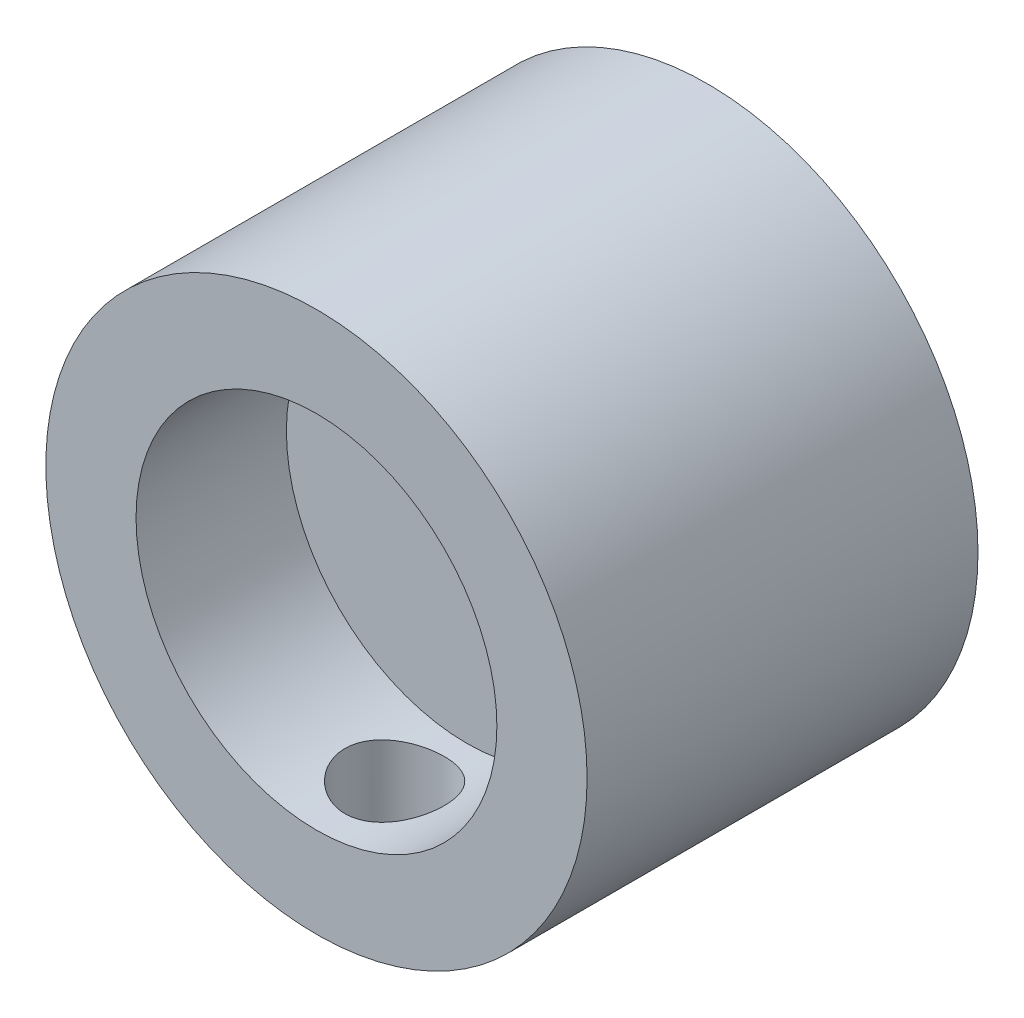
ISO-10303-21;
HEADER;
FILE_DESCRIPTION(('STEP AP214'),'2;1');
FILE_NAME('part.step','',(''),(''),'','','');
FILE_SCHEMA(('AUTOMOTIVE_DESIGN { 1 0 10303 214 1 1 1 1 }'));
ENDSEC;
DATA;
#1=APPLICATION_CONTEXT('core data for automotive mechanical design processes');
#2=APPLICATION_PROTOCOL_DEFINITION('international standard','automotive_design',2000,#1);
#3=PRODUCT_CONTEXT('',#1,'mechanical');
#4=PRODUCT('Part','Part','',(#3));
#5=PRODUCT_RELATED_PRODUCT_CATEGORY('part','',(#4));
#6=PRODUCT_DEFINITION_FORMATION('','',#4);
#7=PRODUCT_DEFINITION_CONTEXT('part definition',#1,'design');
#8=PRODUCT_DEFINITION('design','',#6,#7);
#9=PRODUCT_DEFINITION_SHAPE('','',#8);
#10=(LENGTH_UNIT() NAMED_UNIT(*) SI_UNIT(.MILLI.,.METRE.));
#11=(NAMED_UNIT(*) PLANE_ANGLE_UNIT() SI_UNIT($,.RADIAN.));
#12=(NAMED_UNIT(*) SI_UNIT($,.STERADIAN.) SOLID_ANGLE_UNIT());
#13=UNCERTAINTY_MEASURE_WITH_UNIT(LENGTH_MEASURE(1.E-05),#10,'distance_accuracy_value','');
#14=(GEOMETRIC_REPRESENTATION_CONTEXT(3) GLOBAL_UNCERTAINTY_ASSIGNED_CONTEXT((#13)) GLOBAL_UNIT_ASSIGNED_CONTEXT((#10,
#11,#12)) REPRESENTATION_CONTEXT('',''));
#15=CARTESIAN_POINT('',(0.,0.,0.));
#16=DIRECTION('',(0.,0.,1.));
#17=DIRECTION('',(1.,0.,0.));
#18=AXIS2_PLACEMENT_3D('',#15,#16,#17);
#19=CARTESIAN_POINT('',(0.,0.,6.5));
#20=DIRECTION('',(0.,0.,-1.));
#21=DIRECTION('',(-1.,0.,0.));
#22=AXIS2_PLACEMENT_3D('',#19,#20,#21);
#23=CYLINDRICAL_SURFACE('',#22,4.5);
#24=CARTESIAN_POINT('',(0.,-4.5,6.025));
#25=CARTESIAN_POINT('',(-0.0459281700928139,-4.49999917530483,6.02499822559568));
#26=CARTESIAN_POINT('',(-0.0918796431094405,-4.49928959442492,6.02115177345704));
#27=CARTESIAN_POINT('',(-0.182488974482907,-4.49652731514372,6.00587676549296));
#28=CARTESIAN_POINT('',(-0.227145686129448,-4.49447346197503,5.99444169071123));
#29=CARTESIAN_POINT('',(-0.313841871802195,-4.48925251684029,5.96435029818314));
#30=CARTESIAN_POINT('',(-0.355883625116798,-4.48608641082328,5.94570037451382));
#31=CARTESIAN_POINT('',(-0.436237131717848,-4.47898719212324,5.90172655162366));
#32=CARTESIAN_POINT('',(-0.474549212335565,-4.47505414684107,5.87640323881108));
#33=CARTESIAN_POINT('',(-0.54679955178278,-4.46680510507215,5.81949294539273));
#34=CARTESIAN_POINT('',(-0.580688828252395,-4.46248558919924,5.78784428299845));
#35=CARTESIAN_POINT('',(-0.642707950767929,-4.45397673185431,5.71931438725124));
#36=CARTESIAN_POINT('',(-0.670837394039364,-4.44978739950315,5.68243278827382));
#37=CARTESIAN_POINT('',(-0.720740551756165,-4.44197906683741,5.60413979045922));
#38=CARTESIAN_POINT('',(-0.742464727157539,-4.43836460664535,5.562696323368));
#39=CARTESIAN_POINT('',(-0.778623622334913,-4.43216470314533,5.4766707332707));
#40=CARTESIAN_POINT('',(-0.793058941899276,-4.42957917517188,5.43208886886246));
#41=CARTESIAN_POINT('',(-0.814073749187005,-4.42576522816216,5.34157512682287));
#42=CARTESIAN_POINT('',(-0.820738486828356,-4.42452209331529,5.29566367412523));
#43=CARTESIAN_POINT('',(-0.826287493464283,-4.42348928929569,5.20335864811991));
#44=CARTESIAN_POINT('',(-0.825172429190118,-4.42369949557121,5.15696511646678));
#45=CARTESIAN_POINT('',(-0.815262676170229,-4.42553621693648,5.06562858931755));
#46=CARTESIAN_POINT('',(-0.806564679150546,-4.42714489900884,5.02067469162685));
#47=CARTESIAN_POINT('',(-0.781888128439733,-4.43156932381324,4.93287522372715));
#48=CARTESIAN_POINT('',(-0.76590927773408,-4.43438511578774,4.89002973960759));
#49=CARTESIAN_POINT('',(-0.727029318734104,-4.44092526396813,4.80737904374082));
#50=CARTESIAN_POINT('',(-0.704088936831296,-4.44465475118186,4.76759272957657));
#51=CARTESIAN_POINT('',(-0.651964906185915,-4.45259864386441,4.69239770934376));
#52=CARTESIAN_POINT('',(-0.622780650798149,-4.45681309643332,4.65698942916612));
#53=CARTESIAN_POINT('',(-0.558474835646661,-4.46532989936113,4.59099670711122));
#54=CARTESIAN_POINT('',(-0.523270517507556,-4.46963261790336,4.560492898328));
#55=CARTESIAN_POINT('',(-0.44820144062049,-4.47778277623231,4.50581214608005));
#56=CARTESIAN_POINT('',(-0.408336638963445,-4.48163021182659,4.48163526087394));
#57=CARTESIAN_POINT('',(-0.324995836828234,-4.48844356029465,4.44028372573495));
#58=CARTESIAN_POINT('',(-0.281515717602359,-4.49140844962569,4.42311719762941));
#59=CARTESIAN_POINT('',(-0.192222646689413,-4.49611467763055,4.3963537889379));
#60=CARTESIAN_POINT('',(-0.14640993226227,-4.49785614047962,4.38675614011428));
#61=CARTESIAN_POINT('',(-0.0544461034481382,-4.4999023184439,4.37551455265943));
#62=CARTESIAN_POINT('',(-0.00830892890142174,-4.50022699681417,4.37376009060739));
#63=CARTESIAN_POINT('',(0.0835996344264074,-4.49945807043557,4.37795858944811));
#64=CARTESIAN_POINT('',(0.129371040256893,-4.49836453218584,4.38391118896244));
#65=CARTESIAN_POINT('',(0.218900135953146,-4.4948944586672,4.40326293719226));
#66=CARTESIAN_POINT('',(0.262670263844455,-4.49252751928167,4.4166064129241));
#67=CARTESIAN_POINT('',(0.347352172628146,-4.48677493845965,4.4503010826757));
#68=CARTESIAN_POINT('',(0.388263765965911,-4.48338923025672,4.47065273599871));
#69=CARTESIAN_POINT('',(0.466540724133968,-4.47592488926896,4.51803244691529));
#70=CARTESIAN_POINT('',(0.503864349529048,-4.47183935496324,4.54512835380992));
#71=CARTESIAN_POINT('',(0.573474522487269,-4.46344692785677,4.60513529203137));
#72=CARTESIAN_POINT('',(0.605760621289247,-4.45914001538023,4.63804684088041));
#73=CARTESIAN_POINT('',(0.664797093498946,-4.45072436583967,4.70925024550201));
#74=CARTESIAN_POINT('',(0.691472192912183,-4.44661882879323,4.74760495323504));
#75=CARTESIAN_POINT('',(0.738000962563553,-4.43913417810832,4.82831586501489));
#76=CARTESIAN_POINT('',(0.75785487925133,-4.43575503822673,4.87067192442216));
#77=CARTESIAN_POINT('',(0.79006974659791,-4.43013066716895,4.95798806850776));
#78=CARTESIAN_POINT('',(0.802465816073825,-4.42788012991179,5.00293483862155));
#79=CARTESIAN_POINT('',(0.819521916917249,-4.42475539855508,5.09431808189536));
#80=CARTESIAN_POINT('',(0.824182778471334,-4.42388105675491,5.14075439464381));
#81=CARTESIAN_POINT('',(0.825609336188076,-4.42361497253505,5.23304508440458));
#82=CARTESIAN_POINT('',(0.822493711385451,-4.42420094367903,5.2788976049666));
#83=CARTESIAN_POINT('',(0.808714896388848,-4.42674016349615,5.36941364714329));
#84=CARTESIAN_POINT('',(0.798051746654963,-4.42869340483975,5.41407717513047));
#85=CARTESIAN_POINT('',(0.769529701369722,-4.433737887444,5.50088729822816));
#86=CARTESIAN_POINT('',(0.751683109982067,-4.43682718203726,5.54303805631607));
#87=CARTESIAN_POINT('',(0.709313579378217,-4.44379715840313,5.62376613885392));
#88=CARTESIAN_POINT('',(0.684790197300918,-4.44767789266643,5.66234322604028));
#89=CARTESIAN_POINT('',(0.629348313834032,-4.45586297992699,5.73542448167895));
#90=CARTESIAN_POINT('',(0.598343237903409,-4.46017260473809,5.76986239225247));
#91=CARTESIAN_POINT('',(0.530999103225095,-4.46868991382801,5.8330864331692));
#92=CARTESIAN_POINT('',(0.494658820217836,-4.47289757445043,5.86187126275744));
#93=CARTESIAN_POINT('',(0.417304045779817,-4.48077897857061,5.91320106048681));
#94=CARTESIAN_POINT('',(0.376252242647114,-4.48444784892053,5.93569056728147));
#95=CARTESIAN_POINT('',(0.290899654664465,-4.4907907752263,5.973417895377));
#96=CARTESIAN_POINT('',(0.246602006878925,-4.49346577694763,5.98866261469463));
#97=CARTESIAN_POINT('',(0.168470803519768,-4.49696610500056,6.00832726977452));
#98=CARTESIAN_POINT('',(0.135097554667096,-4.49809746329528,6.01456900133039));
#99=CARTESIAN_POINT('',(0.0678204315214897,-4.49961470652402,6.02290597279418));
#100=CARTESIAN_POINT('',(0.0339165697427318,-4.50000060901253,6.02500131034412));
#101=CARTESIAN_POINT('',(0.,-4.5,6.025));
#102=B_SPLINE_CURVE_WITH_KNOTS('',3,(#24,#25,#26,#27,#28,#29,#30,#31,#32,#33,#34,#35,#36,#37,
#38,#39,#40,#41,#42,#43,#44,#45,#46,#47,#48,#49,#50,#51,#52,#53,#54,#55,#56,#57,#58,#59,#60,#61,
#62,#63,#64,#65,#66,#67,#68,#69,#70,#71,#72,#73,#74,#75,#76,#77,#78,#79,#80,#81,#82,#83,#84,#85,
#86,#87,#88,#89,#90,#91,#92,#93,#94,#95,#96,#97,#98,#99,#100,#101),.UNSPECIFIED.,.T.,.F.,(4,2,2,
2,2,2,2,2,2,2,2,2,2,2,2,2,2,2,2,2,2,2,2,2,2,2,2,2,2,2,2,2,2,2,2,2,2,2,4),(0.,0.137660488066509,
0.275439385812994,0.413096457290011,0.55074143650925,0.689800625056942,0.828869534438103,
0.9689873853198,1.1090937042464,1.24764802678244,1.38619047531911,1.52299175694358,
1.6597986197275,1.79739210021045,1.93499895514125,2.07467712649393,2.21435658396521,
2.35419741065211,2.494024041734,2.63187394453849,2.76971738389717,2.90653634446463,
3.04336427360572,3.18162869513056,3.31990542672838,3.45993311255408,3.59995573864094,
3.73931373299532,3.87865676968845,4.01588629644835,4.15311508756609,4.29010981974406,
4.4271136407834,4.56607996437143,4.70507822627726,4.84526505315317,4.98531813446752,
5.0869786510269,5.18863677358852),.UNSPECIFIED.);
#103=CARTESIAN_POINT('',(0.,-4.5,6.025));
#104=VERTEX_POINT('',#103);
#105=EDGE_CURVE('E54',#104,#104,#102,.T.);
#106=ORIENTED_EDGE('',*,*,#105,.F.);
#107=EDGE_LOOP('',(#106));
#108=FACE_BOUND('',#107,.T.);
#109=CARTESIAN_POINT('',(0.,0.,6.5));
#110=DIRECTION('',(0.,0.,1.));
#111=DIRECTION('',(1.,0.,0.));
#112=AXIS2_PLACEMENT_3D('',#109,#110,#111);
#113=CIRCLE('',#112,4.5);
#114=CARTESIAN_POINT('',(4.5,0.,6.5));
#115=VERTEX_POINT('',#114);
#116=EDGE_CURVE('E10',#115,#115,#113,.T.);
#117=ORIENTED_EDGE('',*,*,#116,.F.);
#118=EDGE_LOOP('',(#117));
#119=FACE_BOUND('',#118,.T.);
#120=CARTESIAN_POINT('',(0.,0.,0.));
#121=DIRECTION('',(0.,0.,1.));
#122=DIRECTION('',(1.,0.,0.));
#123=AXIS2_PLACEMENT_3D('',#120,#121,#122);
#124=CIRCLE('',#123,4.5);
#125=CARTESIAN_POINT('',(4.5,0.,0.));
#126=VERTEX_POINT('',#125);
#127=EDGE_CURVE('E36',#126,#126,#124,.T.);
#128=ORIENTED_EDGE('',*,*,#127,.T.);
#129=EDGE_LOOP('',(#128));
#130=FACE_BOUND('',#129,.T.);
#131=ADVANCED_FACE('F33',(#108,#119,#130),#23,.T.);
#132=CARTESIAN_POINT('',(0.,0.,6.5));
#133=DIRECTION('',(0.,0.,1.));
#134=DIRECTION('',(1.,0.,0.));
#135=AXIS2_PLACEMENT_3D('',#132,#133,#134);
#136=PLANE('',#135);
#137=CARTESIAN_POINT('',(0.,0.,6.5));
#138=DIRECTION('',(0.,0.,1.));
#139=DIRECTION('',(1.,0.,0.));
#140=AXIS2_PLACEMENT_3D('',#137,#138,#139);
#141=CIRCLE('',#140,3.);
#142=CARTESIAN_POINT('',(3.,0.,6.5));
#143=VERTEX_POINT('',#142);
#144=EDGE_CURVE('E45',#143,#143,#141,.T.);
#145=ORIENTED_EDGE('',*,*,#144,.F.);
#146=EDGE_LOOP('',(#145));
#147=FACE_BOUND('',#146,.T.);
#148=ORIENTED_EDGE('',*,*,#116,.T.);
#149=EDGE_LOOP('',(#148));
#150=FACE_BOUND('',#149,.T.);
#151=ADVANCED_FACE('F94',(#147,#150),#136,.T.);
#152=CARTESIAN_POINT('',(0.,0.,0.));
#153=DIRECTION('',(0.,0.,1.));
#154=DIRECTION('',(1.,0.,0.));
#155=AXIS2_PLACEMENT_3D('',#152,#153,#154);
#156=PLANE('',#155);
#157=CARTESIAN_POINT('',(0.,0.,0.));
#158=DIRECTION('',(0.,0.,-1.));
#159=DIRECTION('',(-1.,0.,0.));
#160=AXIS2_PLACEMENT_3D('',#157,#158,#159);
#161=CIRCLE('',#160,2.);
#162=CARTESIAN_POINT('',(-2.,0.,0.));
#163=VERTEX_POINT('',#162);
#164=EDGE_CURVE('E51',#163,#163,#161,.T.);
#165=ORIENTED_EDGE('',*,*,#164,.F.);
#166=EDGE_LOOP('',(#165));
#167=FACE_BOUND('',#166,.T.);
#168=ORIENTED_EDGE('',*,*,#127,.F.);
#169=EDGE_LOOP('',(#168));
#170=FACE_BOUND('',#169,.T.);
#171=ADVANCED_FACE('F92',(#167,#170),#156,.F.);
#172=CARTESIAN_POINT('',(0.,0.,4.));
#173=DIRECTION('',(0.,0.,1.));
#174=DIRECTION('',(1.,0.,0.));
#175=AXIS2_PLACEMENT_3D('',#172,#173,#174);
#176=CYLINDRICAL_SURFACE('',#175,3.);
#177=CARTESIAN_POINT('',(0.,-3.,6.025));
#178=CARTESIAN_POINT('',(0.0454268641638489,-2.9999993715413,6.02499903549822));
#179=CARTESIAN_POINT('',(0.0908638667877851,-2.99895811395233,6.02123544956376));
#180=CARTESIAN_POINT('',(0.180425506278202,-2.99490558812015,6.00630935090333));
#181=CARTESIAN_POINT('',(0.224549560996824,-2.99189345922923,5.99514360574579));
#182=CARTESIAN_POINT('',(0.310179837750131,-2.98423107678343,5.96580625676755));
#183=CARTESIAN_POINT('',(0.351689468212255,-2.97958301039695,5.9476440038865));
#184=CARTESIAN_POINT('',(0.431073766137536,-2.96913800503484,5.90486476341917));
#185=CARTESIAN_POINT('',(0.468948130664998,-2.963340970436,5.88024723853594));
#186=CARTESIAN_POINT('',(0.540915683905446,-2.95106312284588,5.82461905998667));
#187=CARTESIAN_POINT('',(0.574907026756097,-2.94457004665122,5.79347935210197));
#188=CARTESIAN_POINT('',(0.637256811103483,-2.93170928904177,5.72596641714985));
#189=CARTESIAN_POINT('',(0.665614477609762,-2.92534162498757,5.68959247122538));
#190=CARTESIAN_POINT('',(0.716397841440262,-2.91332622461672,5.61181900140959));
#191=CARTESIAN_POINT('',(0.738704670548607,-2.90769390711572,5.57033925865094));
#192=CARTESIAN_POINT('',(0.775986867841303,-2.89796794542873,5.48403795975805));
#193=CARTESIAN_POINT('',(0.790963683807343,-2.89387399743004,5.43921706556556));
#194=CARTESIAN_POINT('',(0.812803750018935,-2.88781520485117,5.34863766811945));
#195=CARTESIAN_POINT('',(0.819852424435962,-2.88580179625248,5.30292720287306));
#196=CARTESIAN_POINT('',(0.826214453334248,-2.88398709478423,5.21093163192872));
#197=CARTESIAN_POINT('',(0.82552935316625,-2.88418535998136,5.16464664287752));
#198=CARTESIAN_POINT('',(0.816590109315663,-2.88672824092654,5.07427727564161));
#199=CARTESIAN_POINT('',(0.808562179101312,-2.88900870586839,5.0301684256649));
#200=CARTESIAN_POINT('',(0.785528228514599,-2.89535606275686,4.94394922857123));
#201=CARTESIAN_POINT('',(0.770521618969846,-2.89942310553304,4.90183905052227));
#202=CARTESIAN_POINT('',(0.733776287018014,-2.90894050342854,4.82023167675013));
#203=CARTESIAN_POINT('',(0.711959701385247,-2.91440671904026,4.78077146853389));
#204=CARTESIAN_POINT('',(0.662267971082816,-2.92609825091175,4.70599345516496));
#205=CARTESIAN_POINT('',(0.634391566029319,-2.93232372497152,4.67067651412813));
#206=CARTESIAN_POINT('',(0.572222789318092,-2.94509771833735,4.60389725600135));
#207=CARTESIAN_POINT('',(0.537740968901036,-2.95164994197944,4.57261175495603));
#208=CARTESIAN_POINT('',(0.463939587067919,-2.96414552979542,4.51622995414387));
#209=CARTESIAN_POINT('',(0.424619810379188,-2.97008886685433,4.49113392993717));
#210=CARTESIAN_POINT('',(0.341973513711249,-2.98073752061149,4.44775870917389));
#211=CARTESIAN_POINT('',(0.29862845070706,-2.98543668051976,4.42951323315123));
#212=CARTESIAN_POINT('',(0.209327066021854,-2.99302308725278,4.40062015035205));
#213=CARTESIAN_POINT('',(0.16337135511753,-2.99591075599835,4.38997077426176));
#214=CARTESIAN_POINT('',(0.0716607531345709,-2.99948430334842,4.37685380425345));
#215=CARTESIAN_POINT('',(0.0259426830989125,-3.00023480244063,4.3741460068334));
#216=CARTESIAN_POINT('',(-0.0652949422987535,-2.99963614615778,4.37632333270626));
#217=CARTESIAN_POINT('',(-0.110814519029499,-2.99828722268615,4.38120761737334));
#218=CARTESIAN_POINT('',(-0.199493885103997,-2.99368317960646,4.39823403074124));
#219=CARTESIAN_POINT('',(-0.242681711939514,-2.99046367237529,4.41024065089258));
#220=CARTESIAN_POINT('',(-0.326424833805954,-2.98248515883347,4.44101219746037));
#221=CARTESIAN_POINT('',(-0.366979834155875,-2.97772598054949,4.45977787885574));
#222=CARTESIAN_POINT('',(-0.445227647958841,-2.96704648856404,4.50397010832479));
#223=CARTESIAN_POINT('',(-0.482844751821884,-2.96110437344164,4.52952530684619));
#224=CARTESIAN_POINT('',(-0.553340483556347,-2.94874504588852,4.5864107701607));
#225=CARTESIAN_POINT('',(-0.586218111543408,-2.94232773363674,4.61774225040447));
#226=CARTESIAN_POINT('',(-0.647325078605074,-2.92950095622831,4.68641422625167));
#227=CARTESIAN_POINT('',(-0.67538451900323,-2.92309755318162,4.72390732953522));
#228=CARTESIAN_POINT('',(-0.724819102449559,-2.91123444107029,4.80320675666806));
#229=CARTESIAN_POINT('',(-0.746194507899183,-2.90577469496339,4.84501291111013));
#230=CARTESIAN_POINT('',(-0.781494584053662,-2.89648055829947,4.93155616509226));
#231=CARTESIAN_POINT('',(-0.795461136346266,-2.89263705742086,4.9762751494153));
#232=CARTESIAN_POINT('',(-0.815638096010245,-2.88701338818225,5.06755176873125));
#233=CARTESIAN_POINT('',(-0.821850640834417,-2.88523265121499,5.11410889337412));
#234=CARTESIAN_POINT('',(-0.826214658751029,-2.88398573745979,5.20599494140662));
#235=CARTESIAN_POINT('',(-0.824640071846792,-2.88444090106919,5.25130997542758));
#236=CARTESIAN_POINT('',(-0.814114399215885,-2.88742914184888,5.34100170800035));
#237=CARTESIAN_POINT('',(-0.805163526724076,-2.88996215895222,5.38537843363889));
#238=CARTESIAN_POINT('',(-0.780302747786438,-2.89677239003195,5.47156448867412));
#239=CARTESIAN_POINT('',(-0.76445436310299,-2.90103416219739,5.51339287132861));
#240=CARTESIAN_POINT('',(-0.726296049805631,-2.91082123926985,5.59382930499404));
#241=CARTESIAN_POINT('',(-0.703985050068571,-2.91634675359934,5.63243682080653));
#242=CARTESIAN_POINT('',(-0.652719339354218,-2.928253637453,5.70663458652732));
#243=CARTESIAN_POINT('',(-0.623579365028384,-2.9346563014994,5.74209342751501));
#244=CARTESIAN_POINT('',(-0.559830669269804,-2.94748112377456,5.8077068555617));
#245=CARTESIAN_POINT('',(-0.525220600823145,-2.9539032864218,5.83786013224714));
#246=CARTESIAN_POINT('',(-0.450546125124637,-2.96622170880806,5.89269629628972));
#247=CARTESIAN_POINT('',(-0.410373854561619,-2.97210232138544,5.91723612805482));
#248=CARTESIAN_POINT('',(-0.326312936319297,-2.98250031689559,5.95917593335645));
#249=CARTESIAN_POINT('',(-0.282426542462521,-2.98701851908365,5.97658019998086));
#250=CARTESIAN_POINT('',(-0.1989598293715,-2.99364298733806,6.00165181625749));
#251=CARTESIAN_POINT('',(-0.159717458274444,-2.99600895524012,6.0103862739757));
#252=CARTESIAN_POINT('',(-0.0803192974365292,-2.99918765171653,6.02206046512436));
#253=CARTESIAN_POINT('',(-0.040163611334321,-3.00000055564414,6.02500085275256));
#254=CARTESIAN_POINT('',(0.,-3.,6.025));
#255=B_SPLINE_CURVE_WITH_KNOTS('',3,(#177,#178,#179,#180,#181,#182,#183,#184,#185,#186,#187,
#188,#189,#190,#191,#192,#193,#194,#195,#196,#197,#198,#199,#200,#201,#202,#203,#204,#205,#206,
#207,#208,#209,#210,#211,#212,#213,#214,#215,#216,#217,#218,#219,#220,#221,#222,#223,#224,#225,
#226,#227,#228,#229,#230,#231,#232,#233,#234,#235,#236,#237,#238,#239,#240,#241,#242,#243,#244,
#245,#246,#247,#248,#249,#250,#251,#252,#253,#254),.UNSPECIFIED.,.T.,.F.,(4,2,2,2,2,2,2,2,2,2,2,
2,2,2,2,2,2,2,2,2,2,2,2,2,2,2,2,2,2,2,2,2,2,2,2,2,2,2,4),(0.,0.136133245617531,
0.272325978137102,0.408337314995788,0.544359976192847,0.683383342371472,0.822425819923212,
0.96402905512331,1.10560431037504,1.24379467576811,1.38195742866733,1.51600206776963,
1.65005802559548,1.78570664544605,1.92138350593853,2.06177987710903,2.20218249770334,
2.34326743513471,2.48431949976163,2.62105888112286,2.75778315924515,2.8919860011587,
3.02620383801724,3.16317288898688,3.30017079407712,3.44129642259716,3.58241651011982,
3.72273012012316,3.86300504303401,3.99838114271792,4.13375332906482,4.26794205677324,
4.40215303785352,4.54054368473717,4.67896846364929,4.82060294140792,4.96215207978405,
5.08252623083627,5.20288678988656),.UNSPECIFIED.);
#256=CARTESIAN_POINT('',(0.,-3.,6.025));
#257=VERTEX_POINT('',#256);
#258=EDGE_CURVE('E64',#257,#257,#255,.T.);
#259=ORIENTED_EDGE('',*,*,#258,.F.);
#260=EDGE_LOOP('',(#259));
#261=FACE_BOUND('',#260,.T.);
#262=CARTESIAN_POINT('',(0.,0.,4.));
#263=DIRECTION('',(0.,0.,1.));
#264=DIRECTION('',(1.,0.,0.));
#265=AXIS2_PLACEMENT_3D('',#262,#263,#264);
#266=CIRCLE('',#265,3.);
#267=CARTESIAN_POINT('',(3.,0.,4.));
#268=VERTEX_POINT('',#267);
#269=EDGE_CURVE('E43',#268,#268,#266,.T.);
#270=ORIENTED_EDGE('',*,*,#269,.F.);
#271=EDGE_LOOP('',(#270));
#272=FACE_BOUND('',#271,.T.);
#273=ORIENTED_EDGE('',*,*,#144,.T.);
#274=EDGE_LOOP('',(#273));
#275=FACE_BOUND('',#274,.T.);
#276=ADVANCED_FACE('F88',(#261,#272,#275),#176,.F.);
#277=CARTESIAN_POINT('',(0.,0.,4.));
#278=DIRECTION('',(0.,0.,1.));
#279=DIRECTION('',(1.,0.,0.));
#280=AXIS2_PLACEMENT_3D('',#277,#278,#279);
#281=PLANE('',#280);
#282=ORIENTED_EDGE('',*,*,#269,.T.);
#283=EDGE_LOOP('',(#282));
#284=FACE_BOUND('',#283,.T.);
#285=ADVANCED_FACE('F84',(#284),#281,.T.);
#286=CARTESIAN_POINT('',(0.,0.,1.95));
#287=DIRECTION('',(0.,0.,-1.));
#288=DIRECTION('',(-1.,0.,0.));
#289=AXIS2_PLACEMENT_3D('',#286,#287,#288);
#290=CYLINDRICAL_SURFACE('',#289,2.);
#291=CARTESIAN_POINT('',(0.,0.,1.95));
#292=DIRECTION('',(0.,0.,-1.));
#293=DIRECTION('',(-1.,0.,0.));
#294=AXIS2_PLACEMENT_3D('',#291,#292,#293);
#295=CIRCLE('',#294,2.);
#296=CARTESIAN_POINT('',(-2.,0.,1.95));
#297=VERTEX_POINT('',#296);
#298=EDGE_CURVE('E48',#297,#297,#295,.T.);
#299=ORIENTED_EDGE('',*,*,#298,.F.);
#300=EDGE_LOOP('',(#299));
#301=FACE_BOUND('',#300,.T.);
#302=ORIENTED_EDGE('',*,*,#164,.T.);
#303=EDGE_LOOP('',(#302));
#304=FACE_BOUND('',#303,.T.);
#305=ADVANCED_FACE('F80',(#301,#304),#290,.F.);
#306=CARTESIAN_POINT('',(0.,0.,1.95));
#307=DIRECTION('',(0.,0.,-1.));
#308=DIRECTION('',(-1.,0.,0.));
#309=AXIS2_PLACEMENT_3D('',#306,#307,#308);
#310=PLANE('',#309);
#311=ORIENTED_EDGE('',*,*,#298,.T.);
#312=EDGE_LOOP('',(#311));
#313=FACE_BOUND('',#312,.T.);
#314=ADVANCED_FACE('F75',(#313),#310,.T.);
#315=CARTESIAN_POINT('',(0.,-4.501,5.2));
#316=DIRECTION('',(0.,1.,0.));
#317=DIRECTION('',(0.,0.,1.));
#318=AXIS2_PLACEMENT_3D('',#315,#316,#317);
#319=CYLINDRICAL_SURFACE('',#318,0.825);
#320=ORIENTED_EDGE('',*,*,#258,.T.);
#321=EDGE_LOOP('',(#320));
#322=FACE_BOUND('',#321,.T.);
#323=ORIENTED_EDGE('',*,*,#105,.T.);
#324=EDGE_LOOP('',(#323));
#325=FACE_BOUND('',#324,.T.);
#326=ADVANCED_FACE('F69',(#322,#325),#319,.F.);
#327=CLOSED_SHELL('',(#131,#151,#171,#276,#285,#305,#314,#326));
#328=MANIFOLD_SOLID_BREP('B2',#327);
#329=ADVANCED_BREP_SHAPE_REPRESENTATION('',(#18,#328),#14);
#330=SHAPE_DEFINITION_REPRESENTATION(#9,#329);
ENDSEC;
END-ISO-10303-21;
